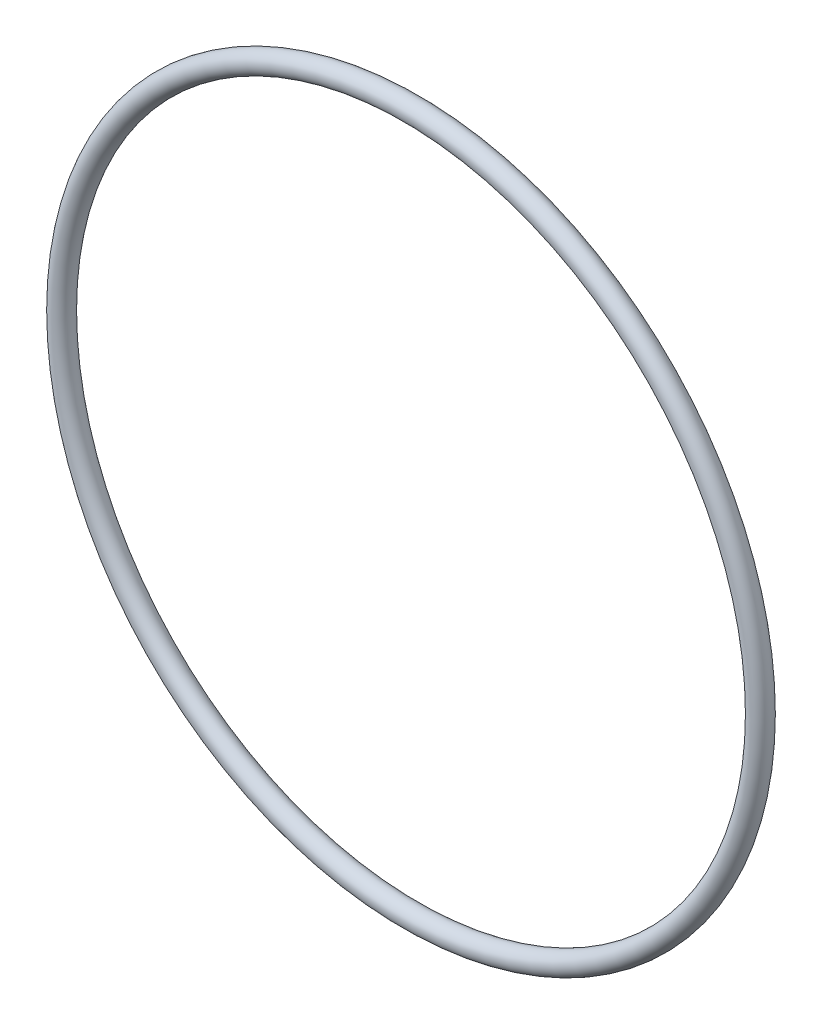
ISO-10303-21;
HEADER;
FILE_DESCRIPTION(('STEP AP214'),'2;1');
FILE_NAME('part.step','',(''),(''),'','','');
FILE_SCHEMA(('AUTOMOTIVE_DESIGN { 1 0 10303 214 1 1 1 1 }'));
ENDSEC;
DATA;
#1=APPLICATION_CONTEXT('core data for automotive mechanical design processes');
#2=APPLICATION_PROTOCOL_DEFINITION('international standard','automotive_design',2000,#1);
#3=PRODUCT_CONTEXT('',#1,'mechanical');
#4=PRODUCT('Part','Part','',(#3));
#5=PRODUCT_RELATED_PRODUCT_CATEGORY('part','',(#4));
#6=PRODUCT_DEFINITION_FORMATION('','',#4);
#7=PRODUCT_DEFINITION_CONTEXT('part definition',#1,'design');
#8=PRODUCT_DEFINITION('design','',#6,#7);
#9=PRODUCT_DEFINITION_SHAPE('','',#8);
#10=(LENGTH_UNIT() NAMED_UNIT(*) SI_UNIT(.MILLI.,.METRE.));
#11=(NAMED_UNIT(*) PLANE_ANGLE_UNIT() SI_UNIT($,.RADIAN.));
#12=(NAMED_UNIT(*) SI_UNIT($,.STERADIAN.) SOLID_ANGLE_UNIT());
#13=UNCERTAINTY_MEASURE_WITH_UNIT(LENGTH_MEASURE(1.E-05),#10,'distance_accuracy_value','');
#14=(GEOMETRIC_REPRESENTATION_CONTEXT(3) GLOBAL_UNCERTAINTY_ASSIGNED_CONTEXT((#13)) GLOBAL_UNIT_ASSIGNED_CONTEXT((#10,
#11,#12)) REPRESENTATION_CONTEXT('',''));
#15=CARTESIAN_POINT('',(0.,0.,0.));
#16=DIRECTION('',(0.,0.,1.));
#17=DIRECTION('',(1.,0.,0.));
#18=AXIS2_PLACEMENT_3D('',#15,#16,#17);
#19=CARTESIAN_POINT('',(0.,0.,0.));
#20=DIRECTION('',(0.,0.,-1.));
#21=DIRECTION('',(-1.,0.,0.));
#22=AXIS2_PLACEMENT_3D('',#19,#20,#21);
#23=TOROIDAL_SURFACE('',#22,41.25,1.25);
#24=CARTESIAN_POINT('',(-42.5,0.,0.));
#25=VERTEX_POINT('',#24);
#26=VERTEX_LOOP('',#25);
#27=FACE_BOUND('',#26,.T.);
#28=ADVANCED_FACE('F37',(#27),#23,.T.);
#29=CLOSED_SHELL('',(#28));
#30=MANIFOLD_SOLID_BREP('B2',#29);
#31=ADVANCED_BREP_SHAPE_REPRESENTATION('',(#18,#30),#14);
#32=SHAPE_DEFINITION_REPRESENTATION(#9,#31);
ENDSEC;
END-ISO-10303-21;
